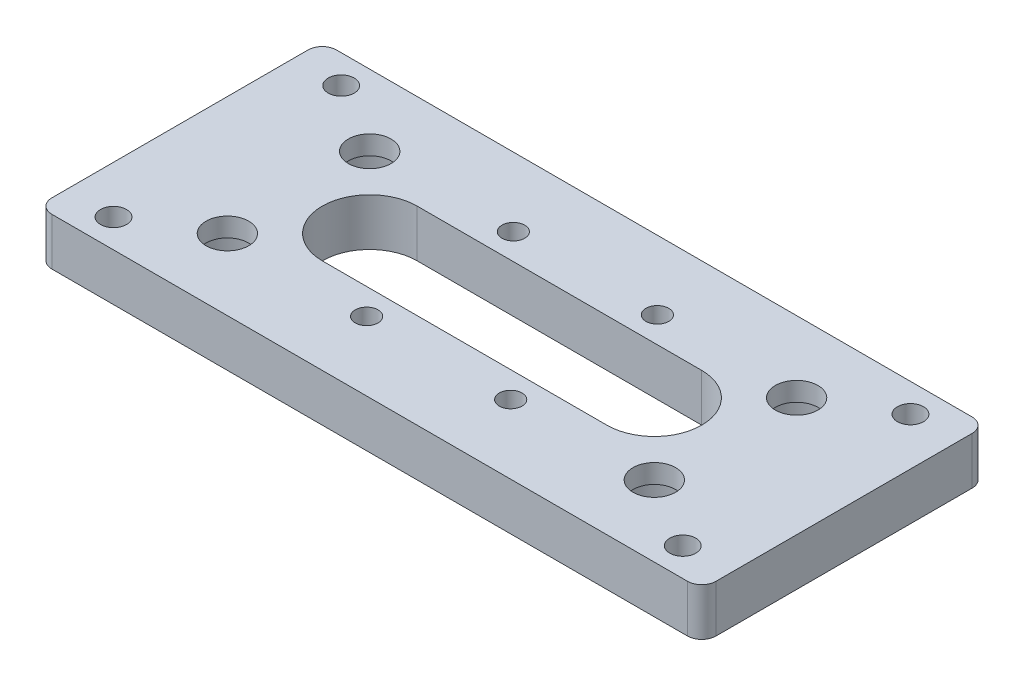
ISO-10303-21;
HEADER;
FILE_DESCRIPTION(('STEP AP214'),'2;1');
FILE_NAME('part.step','',(''),(''),'','','');
FILE_SCHEMA(('AUTOMOTIVE_DESIGN { 1 0 10303 214 1 1 1 1 }'));
ENDSEC;
DATA;
#1=APPLICATION_CONTEXT('core data for automotive mechanical design processes');
#2=APPLICATION_PROTOCOL_DEFINITION('international standard','automotive_design',2000,#1);
#3=PRODUCT_CONTEXT('',#1,'mechanical');
#4=PRODUCT('Part','Part','',(#3));
#5=PRODUCT_RELATED_PRODUCT_CATEGORY('part','',(#4));
#6=PRODUCT_DEFINITION_FORMATION('','',#4);
#7=PRODUCT_DEFINITION_CONTEXT('part definition',#1,'design');
#8=PRODUCT_DEFINITION('design','',#6,#7);
#9=PRODUCT_DEFINITION_SHAPE('','',#8);
#10=(LENGTH_UNIT() NAMED_UNIT(*) SI_UNIT(.MILLI.,.METRE.));
#11=(NAMED_UNIT(*) PLANE_ANGLE_UNIT() SI_UNIT($,.RADIAN.));
#12=(NAMED_UNIT(*) SI_UNIT($,.STERADIAN.) SOLID_ANGLE_UNIT());
#13=UNCERTAINTY_MEASURE_WITH_UNIT(LENGTH_MEASURE(1.E-05),#10,'distance_accuracy_value','');
#14=(GEOMETRIC_REPRESENTATION_CONTEXT(3) GLOBAL_UNCERTAINTY_ASSIGNED_CONTEXT((#13)) GLOBAL_UNIT_ASSIGNED_CONTEXT((#10,
#11,#12)) REPRESENTATION_CONTEXT('',''));
#15=CARTESIAN_POINT('',(0.,0.,0.));
#16=DIRECTION('',(0.,0.,1.));
#17=DIRECTION('',(1.,0.,0.));
#18=AXIS2_PLACEMENT_3D('',#15,#16,#17);
#19=CARTESIAN_POINT('',(67.,9.99999999999999,-27.));
#20=DIRECTION('',(0.,1.,0.));
#21=DIRECTION('',(0.,0.,1.));
#22=AXIS2_PLACEMENT_3D('',#19,#20,#21);
#23=PLANE('',#22);
#24=CARTESIAN_POINT('',(-45.,10.,15.));
#25=DIRECTION('',(0.,-1.,0.));
#26=DIRECTION('',(0.,0.,-1.));
#27=AXIS2_PLACEMENT_3D('',#24,#25,#26);
#28=CIRCLE('',#27,4.5);
#29=CARTESIAN_POINT('',(-45.,10.,10.5));
#30=VERTEX_POINT('',#29);
#31=EDGE_CURVE('E407',#30,#30,#28,.T.);
#32=ORIENTED_EDGE('',*,*,#31,.T.);
#33=EDGE_LOOP('',(#32));
#34=FACE_BOUND('',#33,.T.);
#35=CARTESIAN_POINT('',(-45.,10.,-15.));
#36=DIRECTION('',(0.,-1.,0.));
#37=DIRECTION('',(0.,0.,-1.));
#38=AXIS2_PLACEMENT_3D('',#35,#36,#37);
#39=CIRCLE('',#38,4.5);
#40=CARTESIAN_POINT('',(-45.,10.,-19.5));
#41=VERTEX_POINT('',#40);
#42=EDGE_CURVE('E401',#41,#41,#39,.T.);
#43=ORIENTED_EDGE('',*,*,#42,.T.);
#44=EDGE_LOOP('',(#43));
#45=FACE_BOUND('',#44,.T.);
#46=CARTESIAN_POINT('',(45.,10.,-15.));
#47=DIRECTION('',(0.,-1.,0.));
#48=DIRECTION('',(0.,0.,-1.));
#49=AXIS2_PLACEMENT_3D('',#46,#47,#48);
#50=CIRCLE('',#49,4.5);
#51=CARTESIAN_POINT('',(45.,10.,-19.5));
#52=VERTEX_POINT('',#51);
#53=EDGE_CURVE('E395',#52,#52,#50,.T.);
#54=ORIENTED_EDGE('',*,*,#53,.T.);
#55=EDGE_LOOP('',(#54));
#56=FACE_BOUND('',#55,.T.);
#57=CARTESIAN_POINT('',(60.,9.99999999999999,-24.));
#58=DIRECTION('',(0.,1.,0.));
#59=DIRECTION('',(0.,0.,1.));
#60=AXIS2_PLACEMENT_3D('',#57,#58,#59);
#61=CIRCLE('',#60,2.74999999999999);
#62=CARTESIAN_POINT('',(60.,9.99999999999999,-21.25));
#63=VERTEX_POINT('',#62);
#64=EDGE_CURVE('E202',#63,#63,#61,.T.);
#65=ORIENTED_EDGE('',*,*,#64,.F.);
#66=EDGE_LOOP('',(#65));
#67=FACE_BOUND('',#66,.T.);
#68=CARTESIAN_POINT('',(-60.,10.,24.));
#69=DIRECTION('',(0.,1.,0.));
#70=DIRECTION('',(0.,0.,1.));
#71=AXIS2_PLACEMENT_3D('',#68,#69,#70);
#72=CIRCLE('',#71,2.75);
#73=CARTESIAN_POINT('',(-60.,10.,26.75));
#74=VERTEX_POINT('',#73);
#75=EDGE_CURVE('E214',#74,#74,#72,.T.);
#76=ORIENTED_EDGE('',*,*,#75,.F.);
#77=EDGE_LOOP('',(#76));
#78=FACE_BOUND('',#77,.T.);
#79=CARTESIAN_POINT('',(67.,9.99999999999999,-27.));
#80=DIRECTION('',(0.,1.,0.));
#81=DIRECTION('',(0.,0.,1.));
#82=AXIS2_PLACEMENT_3D('',#79,#80,#81);
#83=CIRCLE('',#82,3.);
#84=CARTESIAN_POINT('',(70.,9.99999999999999,-27.));
#85=VERTEX_POINT('',#84);
#86=CARTESIAN_POINT('',(67.,9.99999999999999,-30.));
#87=VERTEX_POINT('',#86);
#88=EDGE_CURVE('E226',#85,#87,#83,.T.);
#89=ORIENTED_EDGE('',*,*,#88,.T.);
#90=DIRECTION('',(-1.,0.,0.));
#91=VECTOR('',#90,1.);
#92=CARTESIAN_POINT('',(67.,9.99999999999999,-30.));
#93=LINE('',#92,#91);
#94=CARTESIAN_POINT('',(-67.,9.99999999999999,-30.));
#95=VERTEX_POINT('',#94);
#96=EDGE_CURVE('E229',#87,#95,#93,.T.);
#97=ORIENTED_EDGE('',*,*,#96,.T.);
#98=CARTESIAN_POINT('',(-67.,9.99999999999999,-27.));
#99=DIRECTION('',(0.,1.,0.));
#100=DIRECTION('',(0.,0.,1.));
#101=AXIS2_PLACEMENT_3D('',#98,#99,#100);
#102=CIRCLE('',#101,3.);
#103=CARTESIAN_POINT('',(-70.,9.99999999999999,-27.));
#104=VERTEX_POINT('',#103);
#105=EDGE_CURVE('E232',#95,#104,#102,.T.);
#106=ORIENTED_EDGE('',*,*,#105,.T.);
#107=DIRECTION('',(0.,0.,1.));
#108=VECTOR('',#107,1.);
#109=CARTESIAN_POINT('',(-70.,9.99999999999999,-27.));
#110=LINE('',#109,#108);
#111=CARTESIAN_POINT('',(-70.,10.,27.));
#112=VERTEX_POINT('',#111);
#113=EDGE_CURVE('E234',#104,#112,#110,.T.);
#114=ORIENTED_EDGE('',*,*,#113,.T.);
#115=CARTESIAN_POINT('',(-67.,10.,27.));
#116=DIRECTION('',(0.,1.,0.));
#117=DIRECTION('',(0.,0.,1.));
#118=AXIS2_PLACEMENT_3D('',#115,#116,#117);
#119=CIRCLE('',#118,3.);
#120=CARTESIAN_POINT('',(-67.,10.,30.));
#121=VERTEX_POINT('',#120);
#122=EDGE_CURVE('E236',#112,#121,#119,.T.);
#123=ORIENTED_EDGE('',*,*,#122,.T.);
#124=DIRECTION('',(1.,0.,0.));
#125=VECTOR('',#124,1.);
#126=CARTESIAN_POINT('',(-67.,10.,30.));
#127=LINE('',#126,#125);
#128=CARTESIAN_POINT('',(67.,10.,30.));
#129=VERTEX_POINT('',#128);
#130=EDGE_CURVE('E238',#121,#129,#127,.T.);
#131=ORIENTED_EDGE('',*,*,#130,.T.);
#132=CARTESIAN_POINT('',(67.,10.,27.));
#133=DIRECTION('',(0.,1.,0.));
#134=DIRECTION('',(0.,0.,1.));
#135=AXIS2_PLACEMENT_3D('',#132,#133,#134);
#136=CIRCLE('',#135,3.);
#137=CARTESIAN_POINT('',(70.,10.,27.));
#138=VERTEX_POINT('',#137);
#139=EDGE_CURVE('E240',#129,#138,#136,.T.);
#140=ORIENTED_EDGE('',*,*,#139,.T.);
#141=DIRECTION('',(0.,0.,-1.));
#142=VECTOR('',#141,1.);
#143=CARTESIAN_POINT('',(70.,10.,27.));
#144=LINE('',#143,#142);
#145=EDGE_CURVE('E242',#138,#85,#144,.T.);
#146=ORIENTED_EDGE('',*,*,#145,.T.);
#147=EDGE_LOOP('',(#89,#97,#106,#114,#123,#131,#140,#146));
#148=FACE_BOUND('',#147,.T.);
#149=CARTESIAN_POINT('',(-60.,9.99999999999999,-24.));
#150=DIRECTION('',(0.,1.,0.));
#151=DIRECTION('',(0.,0.,1.));
#152=AXIS2_PLACEMENT_3D('',#149,#150,#151);
#153=CIRCLE('',#152,2.75);
#154=CARTESIAN_POINT('',(-60.,9.99999999999999,-21.25));
#155=VERTEX_POINT('',#154);
#156=EDGE_CURVE('E220',#155,#155,#153,.T.);
#157=ORIENTED_EDGE('',*,*,#156,.F.);
#158=EDGE_LOOP('',(#157));
#159=FACE_BOUND('',#158,.T.);
#160=CARTESIAN_POINT('',(60.,10.,24.));
#161=DIRECTION('',(0.,1.,0.));
#162=DIRECTION('',(0.,0.,1.));
#163=AXIS2_PLACEMENT_3D('',#160,#161,#162);
#164=CIRCLE('',#163,2.74999999999999);
#165=CARTESIAN_POINT('',(60.,10.,26.75));
#166=VERTEX_POINT('',#165);
#167=EDGE_CURVE('E208',#166,#166,#164,.T.);
#168=ORIENTED_EDGE('',*,*,#167,.F.);
#169=EDGE_LOOP('',(#168));
#170=FACE_BOUND('',#169,.T.);
#171=CARTESIAN_POINT('',(-15.1817526642759,10.,-15.463217926424));
#172=DIRECTION('',(0.,1.,0.));
#173=DIRECTION('',(0.,0.,1.));
#174=AXIS2_PLACEMENT_3D('',#171,#172,#173);
#175=CIRCLE('',#174,2.4);
#176=CARTESIAN_POINT('',(-15.1817526642759,10.,-13.063217926424));
#177=VERTEX_POINT('',#176);
#178=EDGE_CURVE('E195',#177,#177,#175,.T.);
#179=ORIENTED_EDGE('',*,*,#178,.F.);
#180=EDGE_LOOP('',(#179));
#181=FACE_BOUND('',#180,.T.);
#182=CARTESIAN_POINT('',(15.1817526642759,10.,15.463217926424));
#183=DIRECTION('',(0.,1.,0.));
#184=DIRECTION('',(0.,0.,1.));
#185=AXIS2_PLACEMENT_3D('',#182,#183,#184);
#186=CIRCLE('',#185,2.4);
#187=CARTESIAN_POINT('',(15.1817526642759,10.,17.863217926424));
#188=VERTEX_POINT('',#187);
#189=EDGE_CURVE('E189',#188,#188,#186,.T.);
#190=ORIENTED_EDGE('',*,*,#189,.F.);
#191=EDGE_LOOP('',(#190));
#192=FACE_BOUND('',#191,.T.);
#193=CARTESIAN_POINT('',(15.1817526642759,10.,-15.463217926424));
#194=DIRECTION('',(0.,1.,0.));
#195=DIRECTION('',(0.,0.,1.));
#196=AXIS2_PLACEMENT_3D('',#193,#194,#195);
#197=CIRCLE('',#196,2.4);
#198=CARTESIAN_POINT('',(15.1817526642759,10.,-13.063217926424));
#199=VERTEX_POINT('',#198);
#200=EDGE_CURVE('E183',#199,#199,#197,.T.);
#201=ORIENTED_EDGE('',*,*,#200,.F.);
#202=EDGE_LOOP('',(#201));
#203=FACE_BOUND('',#202,.T.);
#204=CARTESIAN_POINT('',(-15.1817526642759,10.,15.463217926424));
#205=DIRECTION('',(0.,1.,0.));
#206=DIRECTION('',(0.,0.,1.));
#207=AXIS2_PLACEMENT_3D('',#204,#205,#206);
#208=CIRCLE('',#207,2.4);
#209=CARTESIAN_POINT('',(-15.1817526642759,10.,17.863217926424));
#210=VERTEX_POINT('',#209);
#211=EDGE_CURVE('E174',#210,#210,#208,.T.);
#212=ORIENTED_EDGE('',*,*,#211,.F.);
#213=EDGE_LOOP('',(#212));
#214=FACE_BOUND('',#213,.T.);
#215=CARTESIAN_POINT('',(-30.,10.,0.));
#216=DIRECTION('',(0.,1.,0.));
#217=DIRECTION('',(0.,0.,1.));
#218=AXIS2_PLACEMENT_3D('',#215,#216,#217);
#219=CIRCLE('',#218,10.);
#220=CARTESIAN_POINT('',(-30.,10.,-10.));
#221=VERTEX_POINT('',#220);
#222=CARTESIAN_POINT('',(-30.,10.,10.));
#223=VERTEX_POINT('',#222);
#224=EDGE_CURVE('E52',#221,#223,#219,.T.);
#225=ORIENTED_EDGE('',*,*,#224,.F.);
#226=DIRECTION('',(-1.,0.,0.));
#227=VECTOR('',#226,1.);
#228=CARTESIAN_POINT('',(-30.,10.,-10.));
#229=LINE('',#228,#227);
#230=CARTESIAN_POINT('',(30.,10.,-10.));
#231=VERTEX_POINT('',#230);
#232=EDGE_CURVE('E156',#231,#221,#229,.T.);
#233=ORIENTED_EDGE('',*,*,#232,.F.);
#234=CARTESIAN_POINT('',(30.,10.,0.));
#235=DIRECTION('',(0.,1.,0.));
#236=DIRECTION('',(0.,0.,1.));
#237=AXIS2_PLACEMENT_3D('',#234,#235,#236);
#238=CIRCLE('',#237,10.);
#239=CARTESIAN_POINT('',(30.,10.,9.99999999999999));
#240=VERTEX_POINT('',#239);
#241=EDGE_CURVE('E159',#240,#231,#238,.T.);
#242=ORIENTED_EDGE('',*,*,#241,.F.);
#243=DIRECTION('',(1.,0.,0.));
#244=VECTOR('',#243,1.);
#245=CARTESIAN_POINT('',(-30.,10.,10.));
#246=LINE('',#245,#244);
#247=EDGE_CURVE('E168',#223,#240,#246,.T.);
#248=ORIENTED_EDGE('',*,*,#247,.F.);
#249=EDGE_LOOP('',(#225,#233,#242,#248));
#250=FACE_BOUND('',#249,.T.);
#251=CARTESIAN_POINT('',(45.,10.,15.));
#252=DIRECTION('',(0.,-1.,0.));
#253=DIRECTION('',(0.,0.,-1.));
#254=AXIS2_PLACEMENT_3D('',#251,#252,#253);
#255=CIRCLE('',#254,4.5);
#256=CARTESIAN_POINT('',(45.,10.,10.5));
#257=VERTEX_POINT('',#256);
#258=EDGE_CURVE('E389',#257,#257,#255,.T.);
#259=ORIENTED_EDGE('',*,*,#258,.T.);
#260=EDGE_LOOP('',(#259));
#261=FACE_BOUND('',#260,.T.);
#262=ADVANCED_FACE('F37',(#34,#45,#56,#67,#78,#148,#159,#170,#181,#192,#203,#214,#250,#261),#23,.T.);
#263=CARTESIAN_POINT('',(67.,0.,-27.));
#264=DIRECTION('',(0.,1.,0.));
#265=DIRECTION('',(0.,0.,1.));
#266=AXIS2_PLACEMENT_3D('',#263,#264,#265);
#267=PLANE('',#266);
#268=CARTESIAN_POINT('',(45.,0.,15.));
#269=DIRECTION('',(0.,-1.,0.));
#270=DIRECTION('',(0.,0.,-1.));
#271=AXIS2_PLACEMENT_3D('',#268,#269,#270);
#272=CIRCLE('',#271,9.5);
#273=CARTESIAN_POINT('',(45.,0.,5.5));
#274=VERTEX_POINT('',#273);
#275=EDGE_CURVE('E383',#274,#274,#272,.T.);
#276=ORIENTED_EDGE('',*,*,#275,.F.);
#277=EDGE_LOOP('',(#276));
#278=FACE_BOUND('',#277,.T.);
#279=CARTESIAN_POINT('',(-45.,0.,-15.));
#280=DIRECTION('',(0.,-1.,0.));
#281=DIRECTION('',(0.,0.,-1.));
#282=AXIS2_PLACEMENT_3D('',#279,#280,#281);
#283=CIRCLE('',#282,9.5);
#284=CARTESIAN_POINT('',(-45.,0.,-24.5));
#285=VERTEX_POINT('',#284);
#286=EDGE_CURVE('E377',#285,#285,#283,.T.);
#287=ORIENTED_EDGE('',*,*,#286,.F.);
#288=EDGE_LOOP('',(#287));
#289=FACE_BOUND('',#288,.T.);
#290=CARTESIAN_POINT('',(-45.,0.,15.));
#291=DIRECTION('',(0.,-1.,0.));
#292=DIRECTION('',(0.,0.,-1.));
#293=AXIS2_PLACEMENT_3D('',#290,#291,#292);
#294=CIRCLE('',#293,9.5);
#295=CARTESIAN_POINT('',(-45.,0.,5.49999999999999));
#296=VERTEX_POINT('',#295);
#297=EDGE_CURVE('E369',#296,#296,#294,.T.);
#298=ORIENTED_EDGE('',*,*,#297,.F.);
#299=EDGE_LOOP('',(#298));
#300=FACE_BOUND('',#299,.T.);
#301=DIRECTION('',(-1.,0.,0.));
#302=VECTOR('',#301,1.);
#303=CARTESIAN_POINT('',(-30.,0.,-10.));
#304=LINE('',#303,#302);
#305=CARTESIAN_POINT('',(30.,0.,-10.));
#306=VERTEX_POINT('',#305);
#307=CARTESIAN_POINT('',(-30.,0.,-10.));
#308=VERTEX_POINT('',#307);
#309=EDGE_CURVE('E146',#306,#308,#304,.T.);
#310=ORIENTED_EDGE('',*,*,#309,.T.);
#311=CARTESIAN_POINT('',(-30.,0.,0.));
#312=DIRECTION('',(0.,1.,0.));
#313=DIRECTION('',(0.,0.,1.));
#314=AXIS2_PLACEMENT_3D('',#311,#312,#313);
#315=CIRCLE('',#314,10.);
#316=CARTESIAN_POINT('',(-30.,0.,10.));
#317=VERTEX_POINT('',#316);
#318=EDGE_CURVE('E140',#308,#317,#315,.T.);
#319=ORIENTED_EDGE('',*,*,#318,.T.);
#320=DIRECTION('',(1.,0.,0.));
#321=VECTOR('',#320,1.);
#322=CARTESIAN_POINT('',(-30.,0.,10.));
#323=LINE('',#322,#321);
#324=CARTESIAN_POINT('',(30.,0.,10.));
#325=VERTEX_POINT('',#324);
#326=EDGE_CURVE('E149',#317,#325,#323,.T.);
#327=ORIENTED_EDGE('',*,*,#326,.T.);
#328=CARTESIAN_POINT('',(30.,0.,0.));
#329=DIRECTION('',(0.,1.,0.));
#330=DIRECTION('',(0.,0.,1.));
#331=AXIS2_PLACEMENT_3D('',#328,#329,#330);
#332=CIRCLE('',#331,10.);
#333=EDGE_CURVE('E60',#325,#306,#332,.T.);
#334=ORIENTED_EDGE('',*,*,#333,.T.);
#335=EDGE_LOOP('',(#310,#319,#327,#334));
#336=FACE_BOUND('',#335,.T.);
#337=CARTESIAN_POINT('',(67.,0.,-27.));
#338=DIRECTION('',(0.,1.,0.));
#339=DIRECTION('',(0.,0.,1.));
#340=AXIS2_PLACEMENT_3D('',#337,#338,#339);
#341=CIRCLE('',#340,3.);
#342=CARTESIAN_POINT('',(70.,0.,-27.));
#343=VERTEX_POINT('',#342);
#344=CARTESIAN_POINT('',(67.,0.,-30.));
#345=VERTEX_POINT('',#344);
#346=EDGE_CURVE('E223',#343,#345,#341,.T.);
#347=ORIENTED_EDGE('',*,*,#346,.F.);
#348=DIRECTION('',(0.,0.,-1.));
#349=VECTOR('',#348,1.);
#350=CARTESIAN_POINT('',(70.,0.,27.));
#351=LINE('',#350,#349);
#352=CARTESIAN_POINT('',(70.,0.,27.));
#353=VERTEX_POINT('',#352);
#354=EDGE_CURVE('E230',#353,#343,#351,.T.);
#355=ORIENTED_EDGE('',*,*,#354,.F.);
#356=CARTESIAN_POINT('',(67.,0.,27.));
#357=DIRECTION('',(0.,1.,0.));
#358=DIRECTION('',(0.,0.,1.));
#359=AXIS2_PLACEMENT_3D('',#356,#357,#358);
#360=CIRCLE('',#359,3.);
#361=CARTESIAN_POINT('',(67.,0.,30.));
#362=VERTEX_POINT('',#361);
#363=EDGE_CURVE('E257',#362,#353,#360,.T.);
#364=ORIENTED_EDGE('',*,*,#363,.F.);
#365=DIRECTION('',(1.,0.,0.));
#366=VECTOR('',#365,1.);
#367=CARTESIAN_POINT('',(-67.,0.,30.));
#368=LINE('',#367,#366);
#369=CARTESIAN_POINT('',(-67.,0.,30.));
#370=VERTEX_POINT('',#369);
#371=EDGE_CURVE('E255',#370,#362,#368,.T.);
#372=ORIENTED_EDGE('',*,*,#371,.F.);
#373=CARTESIAN_POINT('',(-67.,0.,27.));
#374=DIRECTION('',(0.,1.,0.));
#375=DIRECTION('',(0.,0.,1.));
#376=AXIS2_PLACEMENT_3D('',#373,#374,#375);
#377=CIRCLE('',#376,3.);
#378=CARTESIAN_POINT('',(-70.,0.,27.));
#379=VERTEX_POINT('',#378);
#380=EDGE_CURVE('E253',#379,#370,#377,.T.);
#381=ORIENTED_EDGE('',*,*,#380,.F.);
#382=DIRECTION('',(0.,0.,1.));
#383=VECTOR('',#382,1.);
#384=CARTESIAN_POINT('',(-70.,0.,-27.));
#385=LINE('',#384,#383);
#386=CARTESIAN_POINT('',(-70.,0.,-27.));
#387=VERTEX_POINT('',#386);
#388=EDGE_CURVE('E251',#387,#379,#385,.T.);
#389=ORIENTED_EDGE('',*,*,#388,.F.);
#390=CARTESIAN_POINT('',(-67.,0.,-27.));
#391=DIRECTION('',(0.,1.,0.));
#392=DIRECTION('',(0.,0.,1.));
#393=AXIS2_PLACEMENT_3D('',#390,#391,#392);
#394=CIRCLE('',#393,3.);
#395=CARTESIAN_POINT('',(-67.,0.,-30.));
#396=VERTEX_POINT('',#395);
#397=EDGE_CURVE('E249',#396,#387,#394,.T.);
#398=ORIENTED_EDGE('',*,*,#397,.F.);
#399=DIRECTION('',(-1.,0.,0.));
#400=VECTOR('',#399,1.);
#401=CARTESIAN_POINT('',(67.,0.,-30.));
#402=LINE('',#401,#400);
#403=EDGE_CURVE('E247',#345,#396,#402,.T.);
#404=ORIENTED_EDGE('',*,*,#403,.F.);
#405=EDGE_LOOP('',(#347,#355,#364,#372,#381,#389,#398,#404));
#406=FACE_BOUND('',#405,.T.);
#407=CARTESIAN_POINT('',(-60.,0.,-24.));
#408=DIRECTION('',(0.,1.,0.));
#409=DIRECTION('',(0.,0.,1.));
#410=AXIS2_PLACEMENT_3D('',#407,#408,#409);
#411=CIRCLE('',#410,2.75);
#412=CARTESIAN_POINT('',(-60.,0.,-21.25));
#413=VERTEX_POINT('',#412);
#414=EDGE_CURVE('E217',#413,#413,#411,.T.);
#415=ORIENTED_EDGE('',*,*,#414,.T.);
#416=EDGE_LOOP('',(#415));
#417=FACE_BOUND('',#416,.T.);
#418=CARTESIAN_POINT('',(-60.,0.,24.));
#419=DIRECTION('',(0.,1.,0.));
#420=DIRECTION('',(0.,0.,1.));
#421=AXIS2_PLACEMENT_3D('',#418,#419,#420);
#422=CIRCLE('',#421,2.75);
#423=CARTESIAN_POINT('',(-60.,0.,26.75));
#424=VERTEX_POINT('',#423);
#425=EDGE_CURVE('E211',#424,#424,#422,.T.);
#426=ORIENTED_EDGE('',*,*,#425,.T.);
#427=EDGE_LOOP('',(#426));
#428=FACE_BOUND('',#427,.T.);
#429=CARTESIAN_POINT('',(60.,0.,24.));
#430=DIRECTION('',(0.,1.,0.));
#431=DIRECTION('',(0.,0.,1.));
#432=AXIS2_PLACEMENT_3D('',#429,#430,#431);
#433=CIRCLE('',#432,2.74999999999999);
#434=CARTESIAN_POINT('',(60.,0.,26.75));
#435=VERTEX_POINT('',#434);
#436=EDGE_CURVE('E205',#435,#435,#433,.T.);
#437=ORIENTED_EDGE('',*,*,#436,.T.);
#438=EDGE_LOOP('',(#437));
#439=FACE_BOUND('',#438,.T.);
#440=CARTESIAN_POINT('',(60.,0.,-24.));
#441=DIRECTION('',(0.,1.,0.));
#442=DIRECTION('',(0.,0.,1.));
#443=AXIS2_PLACEMENT_3D('',#440,#441,#442);
#444=CIRCLE('',#443,2.74999999999999);
#445=CARTESIAN_POINT('',(60.,0.,-21.25));
#446=VERTEX_POINT('',#445);
#447=EDGE_CURVE('E201',#446,#446,#444,.T.);
#448=ORIENTED_EDGE('',*,*,#447,.T.);
#449=EDGE_LOOP('',(#448));
#450=FACE_BOUND('',#449,.T.);
#451=CARTESIAN_POINT('',(45.,0.,-15.));
#452=DIRECTION('',(0.,-1.,0.));
#453=DIRECTION('',(0.,0.,-1.));
#454=AXIS2_PLACEMENT_3D('',#451,#452,#453);
#455=CIRCLE('',#454,9.5);
#456=CARTESIAN_POINT('',(45.,0.,-24.5));
#457=VERTEX_POINT('',#456);
#458=EDGE_CURVE('E364',#457,#457,#455,.T.);
#459=ORIENTED_EDGE('',*,*,#458,.F.);
#460=EDGE_LOOP('',(#459));
#461=FACE_BOUND('',#460,.T.);
#462=ADVANCED_FACE('F153',(#278,#289,#300,#336,#406,#417,#428,#439,#450,#461),#267,.F.);
#463=CARTESIAN_POINT('',(67.,9.99999999999999,-27.));
#464=DIRECTION('',(0.,-1.,0.));
#465=DIRECTION('',(0.,0.,-1.));
#466=AXIS2_PLACEMENT_3D('',#463,#464,#465);
#467=CYLINDRICAL_SURFACE('',#466,3.);
#468=ORIENTED_EDGE('',*,*,#346,.T.);
#469=DIRECTION('',(0.,-1.,0.));
#470=VECTOR('',#469,1.);
#471=CARTESIAN_POINT('',(67.,9.99999999999999,-30.));
#472=LINE('',#471,#470);
#473=EDGE_CURVE('E11',#87,#345,#472,.T.);
#474=ORIENTED_EDGE('',*,*,#473,.F.);
#475=ORIENTED_EDGE('',*,*,#88,.F.);
#476=DIRECTION('',(0.,-1.,0.));
#477=VECTOR('',#476,1.);
#478=CARTESIAN_POINT('',(70.,9.99999999999999,-27.));
#479=LINE('',#478,#477);
#480=EDGE_CURVE('E244',#85,#343,#479,.T.);
#481=ORIENTED_EDGE('',*,*,#480,.T.);
#482=EDGE_LOOP('',(#468,#474,#475,#481));
#483=FACE_BOUND('',#482,.T.);
#484=ADVANCED_FACE('F39',(#483),#467,.T.);
#485=CARTESIAN_POINT('',(67.,9.99999999999999,-30.));
#486=DIRECTION('',(0.,0.,1.));
#487=DIRECTION('',(0.,-1.,0.));
#488=AXIS2_PLACEMENT_3D('',#485,#486,#487);
#489=PLANE('',#488);
#490=ORIENTED_EDGE('',*,*,#403,.T.);
#491=DIRECTION('',(0.,-1.,0.));
#492=VECTOR('',#491,1.);
#493=CARTESIAN_POINT('',(-67.,9.99999999999999,-30.));
#494=LINE('',#493,#492);
#495=EDGE_CURVE('E45',#95,#396,#494,.T.);
#496=ORIENTED_EDGE('',*,*,#495,.F.);
#497=ORIENTED_EDGE('',*,*,#96,.F.);
#498=ORIENTED_EDGE('',*,*,#473,.T.);
#499=EDGE_LOOP('',(#490,#496,#497,#498));
#500=FACE_BOUND('',#499,.T.);
#501=ADVANCED_FACE('F303',(#500),#489,.F.);
#502=CARTESIAN_POINT('',(-67.,9.99999999999999,-27.));
#503=DIRECTION('',(0.,-1.,0.));
#504=DIRECTION('',(0.,0.,-1.));
#505=AXIS2_PLACEMENT_3D('',#502,#503,#504);
#506=CYLINDRICAL_SURFACE('',#505,3.);
#507=ORIENTED_EDGE('',*,*,#397,.T.);
#508=DIRECTION('',(0.,-1.,0.));
#509=VECTOR('',#508,1.);
#510=CARTESIAN_POINT('',(-70.,9.99999999999999,-27.));
#511=LINE('',#510,#509);
#512=EDGE_CURVE('E274',#104,#387,#511,.T.);
#513=ORIENTED_EDGE('',*,*,#512,.F.);
#514=ORIENTED_EDGE('',*,*,#105,.F.);
#515=ORIENTED_EDGE('',*,*,#495,.T.);
#516=EDGE_LOOP('',(#507,#513,#514,#515));
#517=FACE_BOUND('',#516,.T.);
#518=ADVANCED_FACE('F281',(#517),#506,.T.);
#519=CARTESIAN_POINT('',(-70.,9.99999999999999,-27.));
#520=DIRECTION('',(1.,0.,0.));
#521=DIRECTION('',(0.,0.,-1.));
#522=AXIS2_PLACEMENT_3D('',#519,#520,#521);
#523=PLANE('',#522);
#524=ORIENTED_EDGE('',*,*,#388,.T.);
#525=DIRECTION('',(0.,-1.,0.));
#526=VECTOR('',#525,1.);
#527=CARTESIAN_POINT('',(-70.,10.,27.));
#528=LINE('',#527,#526);
#529=EDGE_CURVE('E271',#112,#379,#528,.T.);
#530=ORIENTED_EDGE('',*,*,#529,.F.);
#531=ORIENTED_EDGE('',*,*,#113,.F.);
#532=ORIENTED_EDGE('',*,*,#512,.T.);
#533=EDGE_LOOP('',(#524,#530,#531,#532));
#534=FACE_BOUND('',#533,.T.);
#535=ADVANCED_FACE('F291',(#534),#523,.F.);
#536=CARTESIAN_POINT('',(-67.,10.,27.));
#537=DIRECTION('',(0.,-1.,0.));
#538=DIRECTION('',(0.,0.,-1.));
#539=AXIS2_PLACEMENT_3D('',#536,#537,#538);
#540=CYLINDRICAL_SURFACE('',#539,3.);
#541=ORIENTED_EDGE('',*,*,#380,.T.);
#542=DIRECTION('',(0.,-1.,0.));
#543=VECTOR('',#542,1.);
#544=CARTESIAN_POINT('',(-67.,10.,30.));
#545=LINE('',#544,#543);
#546=EDGE_CURVE('E268',#121,#370,#545,.T.);
#547=ORIENTED_EDGE('',*,*,#546,.F.);
#548=ORIENTED_EDGE('',*,*,#122,.F.);
#549=ORIENTED_EDGE('',*,*,#529,.T.);
#550=EDGE_LOOP('',(#541,#547,#548,#549));
#551=FACE_BOUND('',#550,.T.);
#552=ADVANCED_FACE('F295',(#551),#540,.T.);
#553=CARTESIAN_POINT('',(-67.,10.,30.));
#554=DIRECTION('',(0.,0.,-1.));
#555=DIRECTION('',(0.,1.,0.));
#556=AXIS2_PLACEMENT_3D('',#553,#554,#555);
#557=PLANE('',#556);
#558=ORIENTED_EDGE('',*,*,#371,.T.);
#559=DIRECTION('',(0.,-1.,0.));
#560=VECTOR('',#559,1.);
#561=CARTESIAN_POINT('',(67.,10.,30.));
#562=LINE('',#561,#560);
#563=EDGE_CURVE('E265',#129,#362,#562,.T.);
#564=ORIENTED_EDGE('',*,*,#563,.F.);
#565=ORIENTED_EDGE('',*,*,#130,.F.);
#566=ORIENTED_EDGE('',*,*,#546,.T.);
#567=EDGE_LOOP('',(#558,#564,#565,#566));
#568=FACE_BOUND('',#567,.T.);
#569=ADVANCED_FACE('F316',(#568),#557,.F.);
#570=CARTESIAN_POINT('',(67.,10.,27.));
#571=DIRECTION('',(0.,-1.,0.));
#572=DIRECTION('',(0.,0.,-1.));
#573=AXIS2_PLACEMENT_3D('',#570,#571,#572);
#574=CYLINDRICAL_SURFACE('',#573,3.);
#575=ORIENTED_EDGE('',*,*,#363,.T.);
#576=DIRECTION('',(0.,-1.,0.));
#577=VECTOR('',#576,1.);
#578=CARTESIAN_POINT('',(70.,10.,27.));
#579=LINE('',#578,#577);
#580=EDGE_CURVE('E262',#138,#353,#579,.T.);
#581=ORIENTED_EDGE('',*,*,#580,.F.);
#582=ORIENTED_EDGE('',*,*,#139,.F.);
#583=ORIENTED_EDGE('',*,*,#563,.T.);
#584=EDGE_LOOP('',(#575,#581,#582,#583));
#585=FACE_BOUND('',#584,.T.);
#586=ADVANCED_FACE('F314',(#585),#574,.T.);
#587=CARTESIAN_POINT('',(70.,10.,27.));
#588=DIRECTION('',(-1.,0.,0.));
#589=DIRECTION('',(0.,0.,1.));
#590=AXIS2_PLACEMENT_3D('',#587,#588,#589);
#591=PLANE('',#590);
#592=ORIENTED_EDGE('',*,*,#354,.T.);
#593=ORIENTED_EDGE('',*,*,#480,.F.);
#594=ORIENTED_EDGE('',*,*,#145,.F.);
#595=ORIENTED_EDGE('',*,*,#580,.T.);
#596=EDGE_LOOP('',(#592,#593,#594,#595));
#597=FACE_BOUND('',#596,.T.);
#598=ADVANCED_FACE('F309',(#597),#591,.F.);
#599=CARTESIAN_POINT('',(-60.,9.99999999999999,-24.));
#600=DIRECTION('',(0.,-1.,0.));
#601=DIRECTION('',(0.,0.,-1.));
#602=AXIS2_PLACEMENT_3D('',#599,#600,#601);
#603=CYLINDRICAL_SURFACE('',#602,2.75);
#604=ORIENTED_EDGE('',*,*,#156,.T.);
#605=EDGE_LOOP('',(#604));
#606=FACE_BOUND('',#605,.T.);
#607=ORIENTED_EDGE('',*,*,#414,.F.);
#608=EDGE_LOOP('',(#607));
#609=FACE_BOUND('',#608,.T.);
#610=ADVANCED_FACE('F338',(#606,#609),#603,.F.);
#611=CARTESIAN_POINT('',(-60.,10.,24.));
#612=DIRECTION('',(0.,-1.,0.));
#613=DIRECTION('',(0.,0.,-1.));
#614=AXIS2_PLACEMENT_3D('',#611,#612,#613);
#615=CYLINDRICAL_SURFACE('',#614,2.75);
#616=ORIENTED_EDGE('',*,*,#75,.T.);
#617=EDGE_LOOP('',(#616));
#618=FACE_BOUND('',#617,.T.);
#619=ORIENTED_EDGE('',*,*,#425,.F.);
#620=EDGE_LOOP('',(#619));
#621=FACE_BOUND('',#620,.T.);
#622=ADVANCED_FACE('F345',(#618,#621),#615,.F.);
#623=CARTESIAN_POINT('',(60.,10.,24.));
#624=DIRECTION('',(0.,-1.,0.));
#625=DIRECTION('',(0.,0.,-1.));
#626=AXIS2_PLACEMENT_3D('',#623,#624,#625);
#627=CYLINDRICAL_SURFACE('',#626,2.74999999999999);
#628=ORIENTED_EDGE('',*,*,#167,.T.);
#629=EDGE_LOOP('',(#628));
#630=FACE_BOUND('',#629,.T.);
#631=ORIENTED_EDGE('',*,*,#436,.F.);
#632=EDGE_LOOP('',(#631));
#633=FACE_BOUND('',#632,.T.);
#634=ADVANCED_FACE('F350',(#630,#633),#627,.F.);
#635=CARTESIAN_POINT('',(60.,9.99999999999999,-24.));
#636=DIRECTION('',(0.,-1.,0.));
#637=DIRECTION('',(0.,0.,-1.));
#638=AXIS2_PLACEMENT_3D('',#635,#636,#637);
#639=CYLINDRICAL_SURFACE('',#638,2.74999999999999);
#640=ORIENTED_EDGE('',*,*,#64,.T.);
#641=EDGE_LOOP('',(#640));
#642=FACE_BOUND('',#641,.T.);
#643=ORIENTED_EDGE('',*,*,#447,.F.);
#644=EDGE_LOOP('',(#643));
#645=FACE_BOUND('',#644,.T.);
#646=ADVANCED_FACE('F488',(#642,#645),#639,.F.);
#647=CARTESIAN_POINT('',(-15.1817526642759,2.,-15.463217926424));
#648=DIRECTION('',(0.,1.,0.));
#649=DIRECTION('',(0.,0.,1.));
#650=AXIS2_PLACEMENT_3D('',#647,#648,#649);
#651=CONICAL_SURFACE('',#650,2.4,1.02974425867665);
#652=CARTESIAN_POINT('',(-15.1817526642759,0.557934514333851,-15.463217926424));
#653=VERTEX_POINT('',#652);
#654=VERTEX_LOOP('',#653);
#655=FACE_BOUND('',#654,.T.);
#656=CARTESIAN_POINT('',(-15.1817526642759,2.,-15.463217926424));
#657=DIRECTION('',(0.,1.,0.));
#658=DIRECTION('',(0.,0.,1.));
#659=AXIS2_PLACEMENT_3D('',#656,#657,#658);
#660=CIRCLE('',#659,2.4);
#661=CARTESIAN_POINT('',(-15.1817526642759,2.,-13.063217926424));
#662=VERTEX_POINT('',#661);
#663=EDGE_CURVE('E198',#662,#662,#660,.T.);
#664=ORIENTED_EDGE('',*,*,#663,.T.);
#665=EDGE_LOOP('',(#664));
#666=FACE_BOUND('',#665,.T.);
#667=ADVANCED_FACE('F484',(#655,#666),#651,.F.);
#668=CARTESIAN_POINT('',(-15.1817526642759,10.,-15.463217926424));
#669=DIRECTION('',(0.,1.,0.));
#670=DIRECTION('',(0.,0.,1.));
#671=AXIS2_PLACEMENT_3D('',#668,#669,#670);
#672=CYLINDRICAL_SURFACE('',#671,2.4);
#673=ORIENTED_EDGE('',*,*,#663,.F.);
#674=EDGE_LOOP('',(#673));
#675=FACE_BOUND('',#674,.T.);
#676=ORIENTED_EDGE('',*,*,#178,.T.);
#677=EDGE_LOOP('',(#676));
#678=FACE_BOUND('',#677,.T.);
#679=ADVANCED_FACE('F480',(#675,#678),#672,.F.);
#680=CARTESIAN_POINT('',(15.1817526642759,2.,15.463217926424));
#681=DIRECTION('',(0.,1.,0.));
#682=DIRECTION('',(0.,0.,1.));
#683=AXIS2_PLACEMENT_3D('',#680,#681,#682);
#684=CONICAL_SURFACE('',#683,2.4,1.02974425867665);
#685=CARTESIAN_POINT('',(15.1817526642759,0.557934514333858,15.463217926424));
#686=VERTEX_POINT('',#685);
#687=VERTEX_LOOP('',#686);
#688=FACE_BOUND('',#687,.T.);
#689=CARTESIAN_POINT('',(15.1817526642759,2.,15.463217926424));
#690=DIRECTION('',(0.,1.,0.));
#691=DIRECTION('',(0.,0.,1.));
#692=AXIS2_PLACEMENT_3D('',#689,#690,#691);
#693=CIRCLE('',#692,2.4);
#694=CARTESIAN_POINT('',(15.1817526642759,2.,17.863217926424));
#695=VERTEX_POINT('',#694);
#696=EDGE_CURVE('E192',#695,#695,#693,.T.);
#697=ORIENTED_EDGE('',*,*,#696,.T.);
#698=EDGE_LOOP('',(#697));
#699=FACE_BOUND('',#698,.T.);
#700=ADVANCED_FACE('F476',(#688,#699),#684,.F.);
#701=CARTESIAN_POINT('',(15.1817526642759,10.,15.463217926424));
#702=DIRECTION('',(0.,1.,0.));
#703=DIRECTION('',(0.,0.,1.));
#704=AXIS2_PLACEMENT_3D('',#701,#702,#703);
#705=CYLINDRICAL_SURFACE('',#704,2.4);
#706=ORIENTED_EDGE('',*,*,#696,.F.);
#707=EDGE_LOOP('',(#706));
#708=FACE_BOUND('',#707,.T.);
#709=ORIENTED_EDGE('',*,*,#189,.T.);
#710=EDGE_LOOP('',(#709));
#711=FACE_BOUND('',#710,.T.);
#712=ADVANCED_FACE('F472',(#708,#711),#705,.F.);
#713=CARTESIAN_POINT('',(15.1817526642759,2.,-15.463217926424));
#714=DIRECTION('',(0.,1.,0.));
#715=DIRECTION('',(0.,0.,1.));
#716=AXIS2_PLACEMENT_3D('',#713,#714,#715);
#717=CONICAL_SURFACE('',#716,2.4,1.02974425867665);
#718=CARTESIAN_POINT('',(15.1817526642759,0.557934514333851,-15.463217926424));
#719=VERTEX_POINT('',#718);
#720=VERTEX_LOOP('',#719);
#721=FACE_BOUND('',#720,.T.);
#722=CARTESIAN_POINT('',(15.1817526642759,2.,-15.463217926424));
#723=DIRECTION('',(0.,1.,0.));
#724=DIRECTION('',(0.,0.,1.));
#725=AXIS2_PLACEMENT_3D('',#722,#723,#724);
#726=CIRCLE('',#725,2.4);
#727=CARTESIAN_POINT('',(15.1817526642759,2.,-13.063217926424));
#728=VERTEX_POINT('',#727);
#729=EDGE_CURVE('E186',#728,#728,#726,.T.);
#730=ORIENTED_EDGE('',*,*,#729,.T.);
#731=EDGE_LOOP('',(#730));
#732=FACE_BOUND('',#731,.T.);
#733=ADVANCED_FACE('F468',(#721,#732),#717,.F.);
#734=CARTESIAN_POINT('',(15.1817526642759,10.,-15.463217926424));
#735=DIRECTION('',(0.,1.,0.));
#736=DIRECTION('',(0.,0.,1.));
#737=AXIS2_PLACEMENT_3D('',#734,#735,#736);
#738=CYLINDRICAL_SURFACE('',#737,2.4);
#739=ORIENTED_EDGE('',*,*,#729,.F.);
#740=EDGE_LOOP('',(#739));
#741=FACE_BOUND('',#740,.T.);
#742=ORIENTED_EDGE('',*,*,#200,.T.);
#743=EDGE_LOOP('',(#742));
#744=FACE_BOUND('',#743,.T.);
#745=ADVANCED_FACE('F464',(#741,#744),#738,.F.);
#746=CARTESIAN_POINT('',(-15.1817526642759,2.,15.463217926424));
#747=DIRECTION('',(0.,1.,0.));
#748=DIRECTION('',(0.,0.,1.));
#749=AXIS2_PLACEMENT_3D('',#746,#747,#748);
#750=CONICAL_SURFACE('',#749,2.4,1.02974425867665);
#751=CARTESIAN_POINT('',(-15.1817526642759,0.557934514333858,15.463217926424));
#752=VERTEX_POINT('',#751);
#753=VERTEX_LOOP('',#752);
#754=FACE_BOUND('',#753,.T.);
#755=CARTESIAN_POINT('',(-15.1817526642759,2.,15.463217926424));
#756=DIRECTION('',(0.,1.,0.));
#757=DIRECTION('',(0.,0.,1.));
#758=AXIS2_PLACEMENT_3D('',#755,#756,#757);
#759=CIRCLE('',#758,2.4);
#760=CARTESIAN_POINT('',(-15.1817526642759,2.,17.863217926424));
#761=VERTEX_POINT('',#760);
#762=EDGE_CURVE('E180',#761,#761,#759,.T.);
#763=ORIENTED_EDGE('',*,*,#762,.T.);
#764=EDGE_LOOP('',(#763));
#765=FACE_BOUND('',#764,.T.);
#766=ADVANCED_FACE('F460',(#754,#765),#750,.F.);
#767=CARTESIAN_POINT('',(-15.1817526642759,10.,15.463217926424));
#768=DIRECTION('',(0.,1.,0.));
#769=DIRECTION('',(0.,0.,1.));
#770=AXIS2_PLACEMENT_3D('',#767,#768,#769);
#771=CYLINDRICAL_SURFACE('',#770,2.4);
#772=ORIENTED_EDGE('',*,*,#762,.F.);
#773=EDGE_LOOP('',(#772));
#774=FACE_BOUND('',#773,.T.);
#775=ORIENTED_EDGE('',*,*,#211,.T.);
#776=EDGE_LOOP('',(#775));
#777=FACE_BOUND('',#776,.T.);
#778=ADVANCED_FACE('F457',(#774,#777),#771,.F.);
#779=CARTESIAN_POINT('',(-30.,0.,0.));
#780=DIRECTION('',(0.,1.,0.));
#781=DIRECTION('',(0.,0.,1.));
#782=AXIS2_PLACEMENT_3D('',#779,#780,#781);
#783=CYLINDRICAL_SURFACE('',#782,10.);
#784=ORIENTED_EDGE('',*,*,#224,.T.);
#785=DIRECTION('',(0.,1.,0.));
#786=VECTOR('',#785,1.);
#787=CARTESIAN_POINT('',(-30.,0.,10.));
#788=LINE('',#787,#786);
#789=EDGE_CURVE('E136',#317,#223,#788,.T.);
#790=ORIENTED_EDGE('',*,*,#789,.F.);
#791=ORIENTED_EDGE('',*,*,#318,.F.);
#792=DIRECTION('',(0.,1.,0.));
#793=VECTOR('',#792,1.);
#794=CARTESIAN_POINT('',(-30.,0.,-10.));
#795=LINE('',#794,#793);
#796=EDGE_CURVE('E172',#308,#221,#795,.T.);
#797=ORIENTED_EDGE('',*,*,#796,.T.);
#798=EDGE_LOOP('',(#784,#790,#791,#797));
#799=FACE_BOUND('',#798,.T.);
#800=ADVANCED_FACE('F138',(#799),#783,.F.);
#801=CARTESIAN_POINT('',(-30.,0.,-10.));
#802=DIRECTION('',(0.,0.,-1.));
#803=DIRECTION('',(0.,1.,0.));
#804=AXIS2_PLACEMENT_3D('',#801,#802,#803);
#805=PLANE('',#804);
#806=ORIENTED_EDGE('',*,*,#232,.T.);
#807=ORIENTED_EDGE('',*,*,#796,.F.);
#808=ORIENTED_EDGE('',*,*,#309,.F.);
#809=DIRECTION('',(0.,1.,0.));
#810=VECTOR('',#809,1.);
#811=CARTESIAN_POINT('',(30.,0.,-10.));
#812=LINE('',#811,#810);
#813=EDGE_CURVE('E175',#306,#231,#812,.T.);
#814=ORIENTED_EDGE('',*,*,#813,.T.);
#815=EDGE_LOOP('',(#806,#807,#808,#814));
#816=FACE_BOUND('',#815,.T.);
#817=ADVANCED_FACE('F446',(#816),#805,.F.);
#818=CARTESIAN_POINT('',(30.,0.,0.));
#819=DIRECTION('',(0.,1.,0.));
#820=DIRECTION('',(0.,0.,1.));
#821=AXIS2_PLACEMENT_3D('',#818,#819,#820);
#822=CYLINDRICAL_SURFACE('',#821,10.);
#823=ORIENTED_EDGE('',*,*,#241,.T.);
#824=ORIENTED_EDGE('',*,*,#813,.F.);
#825=ORIENTED_EDGE('',*,*,#333,.F.);
#826=DIRECTION('',(0.,1.,0.));
#827=VECTOR('',#826,1.);
#828=CARTESIAN_POINT('',(30.,0.,9.99999999999999));
#829=LINE('',#828,#827);
#830=EDGE_CURVE('E145',#325,#240,#829,.T.);
#831=ORIENTED_EDGE('',*,*,#830,.T.);
#832=EDGE_LOOP('',(#823,#824,#825,#831));
#833=FACE_BOUND('',#832,.T.);
#834=ADVANCED_FACE('F449',(#833),#822,.F.);
#835=CARTESIAN_POINT('',(-30.,0.,10.));
#836=DIRECTION('',(0.,0.,1.));
#837=DIRECTION('',(0.,-1.,0.));
#838=AXIS2_PLACEMENT_3D('',#835,#836,#837);
#839=PLANE('',#838);
#840=ORIENTED_EDGE('',*,*,#247,.T.);
#841=ORIENTED_EDGE('',*,*,#830,.F.);
#842=ORIENTED_EDGE('',*,*,#326,.F.);
#843=ORIENTED_EDGE('',*,*,#789,.T.);
#844=EDGE_LOOP('',(#840,#841,#842,#843));
#845=FACE_BOUND('',#844,.T.);
#846=ADVANCED_FACE('F150',(#845),#839,.F.);
#847=CARTESIAN_POINT('',(45.,6.,-15.));
#848=DIRECTION('',(0.,1.,0.));
#849=DIRECTION('',(0.,0.,1.));
#850=AXIS2_PLACEMENT_3D('',#847,#848,#849);
#851=PLANE('',#850);
#852=CARTESIAN_POINT('',(45.,6.,-15.));
#853=DIRECTION('',(0.,1.,0.));
#854=DIRECTION('',(0.,0.,1.));
#855=AXIS2_PLACEMENT_3D('',#852,#853,#854);
#856=CIRCLE('',#855,4.49999999999999);
#857=CARTESIAN_POINT('',(45.,6.,-10.5));
#858=VERTEX_POINT('',#857);
#859=EDGE_CURVE('E392',#858,#858,#856,.T.);
#860=ORIENTED_EDGE('',*,*,#859,.T.);
#861=EDGE_LOOP('',(#860));
#862=FACE_BOUND('',#861,.T.);
#863=CARTESIAN_POINT('',(45.,6.,-15.));
#864=DIRECTION('',(0.,-1.,0.));
#865=DIRECTION('',(0.,0.,-1.));
#866=AXIS2_PLACEMENT_3D('',#863,#864,#865);
#867=CIRCLE('',#866,9.5);
#868=CARTESIAN_POINT('',(45.,6.,-24.5));
#869=VERTEX_POINT('',#868);
#870=EDGE_CURVE('E162',#869,#869,#867,.T.);
#871=ORIENTED_EDGE('',*,*,#870,.T.);
#872=EDGE_LOOP('',(#871));
#873=FACE_BOUND('',#872,.T.);
#874=ADVANCED_FACE('F441',(#862,#873),#851,.F.);
#875=CARTESIAN_POINT('',(45.,0.,-15.));
#876=DIRECTION('',(0.,-1.,0.));
#877=DIRECTION('',(0.,0.,-1.));
#878=AXIS2_PLACEMENT_3D('',#875,#876,#877);
#879=CYLINDRICAL_SURFACE('',#878,9.5);
#880=ORIENTED_EDGE('',*,*,#870,.F.);
#881=EDGE_LOOP('',(#880));
#882=FACE_BOUND('',#881,.T.);
#883=ORIENTED_EDGE('',*,*,#458,.T.);
#884=EDGE_LOOP('',(#883));
#885=FACE_BOUND('',#884,.T.);
#886=ADVANCED_FACE('F421',(#882,#885),#879,.F.);
#887=CARTESIAN_POINT('',(-45.,6.,15.));
#888=DIRECTION('',(0.,1.,0.));
#889=DIRECTION('',(0.,0.,1.));
#890=AXIS2_PLACEMENT_3D('',#887,#888,#889);
#891=PLANE('',#890);
#892=CARTESIAN_POINT('',(-45.,6.,15.));
#893=DIRECTION('',(0.,1.,0.));
#894=DIRECTION('',(0.,0.,1.));
#895=AXIS2_PLACEMENT_3D('',#892,#893,#894);
#896=CIRCLE('',#895,4.49999999999999);
#897=CARTESIAN_POINT('',(-45.,6.,19.5));
#898=VERTEX_POINT('',#897);
#899=EDGE_CURVE('E404',#898,#898,#896,.T.);
#900=ORIENTED_EDGE('',*,*,#899,.T.);
#901=EDGE_LOOP('',(#900));
#902=FACE_BOUND('',#901,.T.);
#903=CARTESIAN_POINT('',(-45.,6.,15.));
#904=DIRECTION('',(0.,-1.,0.));
#905=DIRECTION('',(0.,0.,-1.));
#906=AXIS2_PLACEMENT_3D('',#903,#904,#905);
#907=CIRCLE('',#906,9.49999999999999);
#908=CARTESIAN_POINT('',(-45.,6.,5.5));
#909=VERTEX_POINT('',#908);
#910=EDGE_CURVE('E366',#909,#909,#907,.T.);
#911=ORIENTED_EDGE('',*,*,#910,.T.);
#912=EDGE_LOOP('',(#911));
#913=FACE_BOUND('',#912,.T.);
#914=ADVANCED_FACE('F417',(#902,#913),#891,.F.);
#915=CARTESIAN_POINT('',(-45.,0.,15.));
#916=DIRECTION('',(0.,-1.,0.));
#917=DIRECTION('',(0.,0.,-1.));
#918=AXIS2_PLACEMENT_3D('',#915,#916,#917);
#919=CYLINDRICAL_SURFACE('',#918,9.5);
#920=ORIENTED_EDGE('',*,*,#910,.F.);
#921=EDGE_LOOP('',(#920));
#922=FACE_BOUND('',#921,.T.);
#923=ORIENTED_EDGE('',*,*,#297,.T.);
#924=EDGE_LOOP('',(#923));
#925=FACE_BOUND('',#924,.T.);
#926=ADVANCED_FACE('F420',(#922,#925),#919,.F.);
#927=CARTESIAN_POINT('',(-45.,6.,-15.));
#928=DIRECTION('',(0.,1.,0.));
#929=DIRECTION('',(0.,0.,1.));
#930=AXIS2_PLACEMENT_3D('',#927,#928,#929);
#931=PLANE('',#930);
#932=CARTESIAN_POINT('',(-45.,6.,-15.));
#933=DIRECTION('',(0.,1.,0.));
#934=DIRECTION('',(0.,0.,1.));
#935=AXIS2_PLACEMENT_3D('',#932,#933,#934);
#936=CIRCLE('',#935,4.49999999999999);
#937=CARTESIAN_POINT('',(-45.,6.,-10.5));
#938=VERTEX_POINT('',#937);
#939=EDGE_CURVE('E398',#938,#938,#936,.T.);
#940=ORIENTED_EDGE('',*,*,#939,.T.);
#941=EDGE_LOOP('',(#940));
#942=FACE_BOUND('',#941,.T.);
#943=CARTESIAN_POINT('',(-45.,6.,-15.));
#944=DIRECTION('',(0.,-1.,0.));
#945=DIRECTION('',(0.,0.,-1.));
#946=AXIS2_PLACEMENT_3D('',#943,#944,#945);
#947=CIRCLE('',#946,9.5);
#948=CARTESIAN_POINT('',(-45.,6.,-24.5));
#949=VERTEX_POINT('',#948);
#950=EDGE_CURVE('E374',#949,#949,#947,.T.);
#951=ORIENTED_EDGE('',*,*,#950,.T.);
#952=EDGE_LOOP('',(#951));
#953=FACE_BOUND('',#952,.T.);
#954=ADVANCED_FACE('F427',(#942,#953),#931,.F.);
#955=CARTESIAN_POINT('',(-45.,0.,-15.));
#956=DIRECTION('',(0.,-1.,0.));
#957=DIRECTION('',(0.,0.,-1.));
#958=AXIS2_PLACEMENT_3D('',#955,#956,#957);
#959=CYLINDRICAL_SURFACE('',#958,9.5);
#960=ORIENTED_EDGE('',*,*,#950,.F.);
#961=EDGE_LOOP('',(#960));
#962=FACE_BOUND('',#961,.T.);
#963=ORIENTED_EDGE('',*,*,#286,.T.);
#964=EDGE_LOOP('',(#963));
#965=FACE_BOUND('',#964,.T.);
#966=ADVANCED_FACE('F434',(#962,#965),#959,.F.);
#967=CARTESIAN_POINT('',(45.,6.,15.));
#968=DIRECTION('',(0.,1.,0.));
#969=DIRECTION('',(0.,0.,1.));
#970=AXIS2_PLACEMENT_3D('',#967,#968,#969);
#971=PLANE('',#970);
#972=CARTESIAN_POINT('',(45.,6.,15.));
#973=DIRECTION('',(0.,1.,0.));
#974=DIRECTION('',(0.,0.,1.));
#975=AXIS2_PLACEMENT_3D('',#972,#973,#974);
#976=CIRCLE('',#975,4.49999999999999);
#977=CARTESIAN_POINT('',(45.,6.,19.5));
#978=VERTEX_POINT('',#977);
#979=EDGE_CURVE('E386',#978,#978,#976,.T.);
#980=ORIENTED_EDGE('',*,*,#979,.T.);
#981=EDGE_LOOP('',(#980));
#982=FACE_BOUND('',#981,.T.);
#983=CARTESIAN_POINT('',(45.,6.,15.));
#984=DIRECTION('',(0.,-1.,0.));
#985=DIRECTION('',(0.,0.,-1.));
#986=AXIS2_PLACEMENT_3D('',#983,#984,#985);
#987=CIRCLE('',#986,9.49999999999999);
#988=CARTESIAN_POINT('',(45.,6.,5.50000000000001));
#989=VERTEX_POINT('',#988);
#990=EDGE_CURVE('E380',#989,#989,#987,.T.);
#991=ORIENTED_EDGE('',*,*,#990,.T.);
#992=EDGE_LOOP('',(#991));
#993=FACE_BOUND('',#992,.T.);
#994=ADVANCED_FACE('F521',(#982,#993),#971,.F.);
#995=CARTESIAN_POINT('',(45.,0.,15.));
#996=DIRECTION('',(0.,-1.,0.));
#997=DIRECTION('',(0.,0.,-1.));
#998=AXIS2_PLACEMENT_3D('',#995,#996,#997);
#999=CYLINDRICAL_SURFACE('',#998,9.5);
#1000=ORIENTED_EDGE('',*,*,#990,.F.);
#1001=EDGE_LOOP('',(#1000));
#1002=FACE_BOUND('',#1001,.T.);
#1003=ORIENTED_EDGE('',*,*,#275,.T.);
#1004=EDGE_LOOP('',(#1003));
#1005=FACE_BOUND('',#1004,.T.);
#1006=ADVANCED_FACE('F517',(#1002,#1005),#999,.F.);
#1007=CARTESIAN_POINT('',(45.,0.,15.));
#1008=DIRECTION('',(0.,-1.,0.));
#1009=DIRECTION('',(0.,0.,-1.));
#1010=AXIS2_PLACEMENT_3D('',#1007,#1008,#1009);
#1011=CYLINDRICAL_SURFACE('',#1010,4.49999999999999);
#1012=ORIENTED_EDGE('',*,*,#258,.F.);
#1013=EDGE_LOOP('',(#1012));
#1014=FACE_BOUND('',#1013,.T.);
#1015=ORIENTED_EDGE('',*,*,#979,.F.);
#1016=EDGE_LOOP('',(#1015));
#1017=FACE_BOUND('',#1016,.T.);
#1018=ADVANCED_FACE('F513',(#1014,#1017),#1011,.F.);
#1019=CARTESIAN_POINT('',(45.,0.,-15.));
#1020=DIRECTION('',(0.,-1.,0.));
#1021=DIRECTION('',(0.,0.,-1.));
#1022=AXIS2_PLACEMENT_3D('',#1019,#1020,#1021);
#1023=CYLINDRICAL_SURFACE('',#1022,4.49999999999999);
#1024=ORIENTED_EDGE('',*,*,#53,.F.);
#1025=EDGE_LOOP('',(#1024));
#1026=FACE_BOUND('',#1025,.T.);
#1027=ORIENTED_EDGE('',*,*,#859,.F.);
#1028=EDGE_LOOP('',(#1027));
#1029=FACE_BOUND('',#1028,.T.);
#1030=ADVANCED_FACE('F516',(#1026,#1029),#1023,.F.);
#1031=CARTESIAN_POINT('',(-45.,0.,-15.));
#1032=DIRECTION('',(0.,-1.,0.));
#1033=DIRECTION('',(0.,0.,-1.));
#1034=AXIS2_PLACEMENT_3D('',#1031,#1032,#1033);
#1035=CYLINDRICAL_SURFACE('',#1034,4.49999999999999);
#1036=ORIENTED_EDGE('',*,*,#42,.F.);
#1037=EDGE_LOOP('',(#1036));
#1038=FACE_BOUND('',#1037,.T.);
#1039=ORIENTED_EDGE('',*,*,#939,.F.);
#1040=EDGE_LOOP('',(#1039));
#1041=FACE_BOUND('',#1040,.T.);
#1042=ADVANCED_FACE('F413',(#1038,#1041),#1035,.F.);
#1043=CARTESIAN_POINT('',(-45.,0.,15.));
#1044=DIRECTION('',(0.,-1.,0.));
#1045=DIRECTION('',(0.,0.,-1.));
#1046=AXIS2_PLACEMENT_3D('',#1043,#1044,#1045);
#1047=CYLINDRICAL_SURFACE('',#1046,4.49999999999999);
#1048=ORIENTED_EDGE('',*,*,#31,.F.);
#1049=EDGE_LOOP('',(#1048));
#1050=FACE_BOUND('',#1049,.T.);
#1051=ORIENTED_EDGE('',*,*,#899,.F.);
#1052=EDGE_LOOP('',(#1051));
#1053=FACE_BOUND('',#1052,.T.);
#1054=ADVANCED_FACE('F410',(#1050,#1053),#1047,.F.);
#1055=CLOSED_SHELL('',(#262,#462,#484,#501,#518,#535,#552,#569,#586,#598,#610,#622,#634,#646,
#667,#679,#700,#712,#733,#745,#766,#778,#800,#817,#834,#846,#874,#886,#914,#926,#954,#966,#994,
#1006,#1018,#1030,#1042,#1054));
#1056=MANIFOLD_SOLID_BREP('B2',#1055);
#1057=ADVANCED_BREP_SHAPE_REPRESENTATION('',(#18,#1056),#14);
#1058=SHAPE_DEFINITION_REPRESENTATION(#9,#1057);
ENDSEC;
END-ISO-10303-21;
